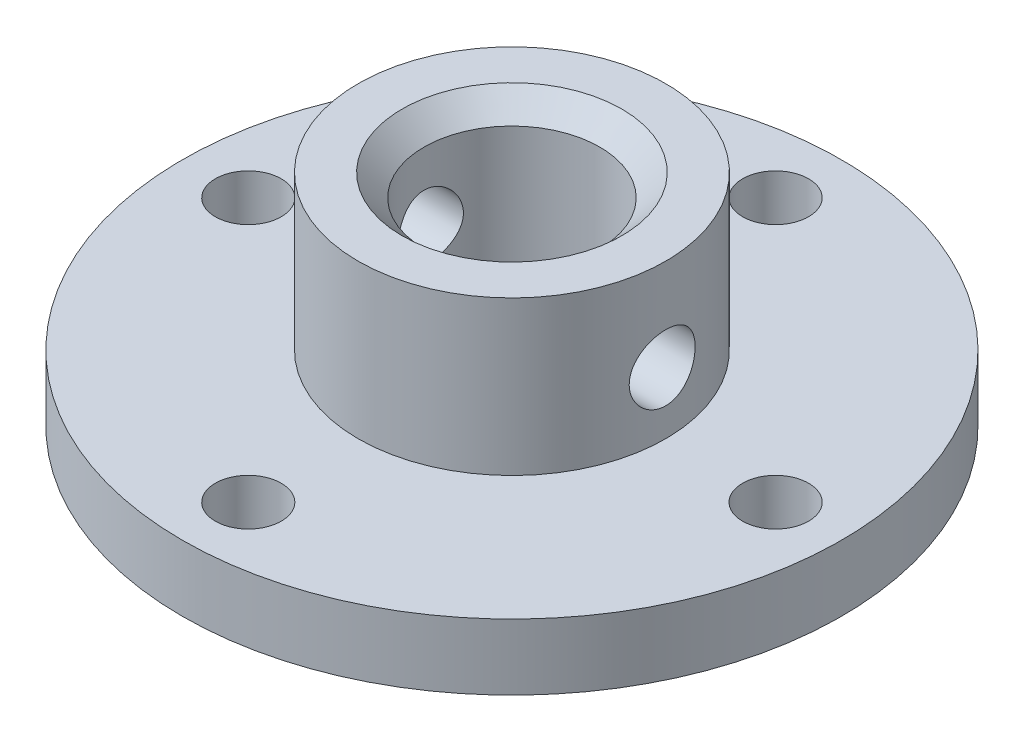
ISO-10303-21;
HEADER;
FILE_DESCRIPTION(('STEP AP214'),'2;1');
FILE_NAME('part.step','',(''),(''),'','','');
FILE_SCHEMA(('AUTOMOTIVE_DESIGN { 1 0 10303 214 1 1 1 1 }'));
ENDSEC;
DATA;
#1=APPLICATION_CONTEXT('core data for automotive mechanical design processes');
#2=APPLICATION_PROTOCOL_DEFINITION('international standard','automotive_design',2000,#1);
#3=PRODUCT_CONTEXT('',#1,'mechanical');
#4=PRODUCT('Part','Part','',(#3));
#5=PRODUCT_RELATED_PRODUCT_CATEGORY('part','',(#4));
#6=PRODUCT_DEFINITION_FORMATION('','',#4);
#7=PRODUCT_DEFINITION_CONTEXT('part definition',#1,'design');
#8=PRODUCT_DEFINITION('design','',#6,#7);
#9=PRODUCT_DEFINITION_SHAPE('','',#8);
#10=(LENGTH_UNIT() NAMED_UNIT(*) SI_UNIT(.MILLI.,.METRE.));
#11=(NAMED_UNIT(*) PLANE_ANGLE_UNIT() SI_UNIT($,.RADIAN.));
#12=(NAMED_UNIT(*) SI_UNIT($,.STERADIAN.) SOLID_ANGLE_UNIT());
#13=UNCERTAINTY_MEASURE_WITH_UNIT(LENGTH_MEASURE(1.E-05),#10,'distance_accuracy_value','');
#14=(GEOMETRIC_REPRESENTATION_CONTEXT(3) GLOBAL_UNCERTAINTY_ASSIGNED_CONTEXT((#13)) GLOBAL_UNIT_ASSIGNED_CONTEXT((#10,
#11,#12)) REPRESENTATION_CONTEXT('',''));
#15=CARTESIAN_POINT('',(0.,0.,0.));
#16=DIRECTION('',(0.,0.,1.));
#17=DIRECTION('',(1.,0.,0.));
#18=AXIS2_PLACEMENT_3D('',#15,#16,#17);
#19=CARTESIAN_POINT('',(0.,3.,0.));
#20=DIRECTION('',(0.,1.,0.));
#21=DIRECTION('',(0.,0.,1.));
#22=AXIS2_PLACEMENT_3D('',#19,#20,#21);
#23=PLANE('',#22);
#24=CARTESIAN_POINT('',(12.,3.,1.25693328198353E-13));
#25=DIRECTION('',(0.,1.,0.));
#26=DIRECTION('',(0.,0.,1.));
#27=AXIS2_PLACEMENT_3D('',#24,#25,#26);
#28=CIRCLE('',#27,1.5);
#29=CARTESIAN_POINT('',(12.,3.,1.50000000000013));
#30=VERTEX_POINT('',#29);
#31=EDGE_CURVE('E90',#30,#30,#28,.T.);
#32=ORIENTED_EDGE('',*,*,#31,.F.);
#33=EDGE_LOOP('',(#32));
#34=FACE_BOUND('',#33,.T.);
#35=CARTESIAN_POINT('',(0.,3.,12.));
#36=DIRECTION('',(0.,1.,0.));
#37=DIRECTION('',(0.,0.,1.));
#38=AXIS2_PLACEMENT_3D('',#35,#36,#37);
#39=CIRCLE('',#38,1.5);
#40=CARTESIAN_POINT('',(0.,3.,13.5));
#41=VERTEX_POINT('',#40);
#42=EDGE_CURVE('E301',#41,#41,#39,.T.);
#43=ORIENTED_EDGE('',*,*,#42,.F.);
#44=EDGE_LOOP('',(#43));
#45=FACE_BOUND('',#44,.T.);
#46=CARTESIAN_POINT('',(-12.,3.,0.));
#47=DIRECTION('',(0.,1.,0.));
#48=DIRECTION('',(0.,0.,1.));
#49=AXIS2_PLACEMENT_3D('',#46,#47,#48);
#50=CIRCLE('',#49,1.5);
#51=CARTESIAN_POINT('',(-12.,3.,1.49999999999996));
#52=VERTEX_POINT('',#51);
#53=EDGE_CURVE('E299',#52,#52,#50,.T.);
#54=ORIENTED_EDGE('',*,*,#53,.F.);
#55=EDGE_LOOP('',(#54));
#56=FACE_BOUND('',#55,.T.);
#57=CARTESIAN_POINT('',(0.,3.,-12.));
#58=DIRECTION('',(0.,1.,0.));
#59=DIRECTION('',(0.,0.,1.));
#60=AXIS2_PLACEMENT_3D('',#57,#58,#59);
#61=CIRCLE('',#60,1.5);
#62=CARTESIAN_POINT('',(0.,3.,-10.5));
#63=VERTEX_POINT('',#62);
#64=EDGE_CURVE('E129',#63,#63,#61,.T.);
#65=ORIENTED_EDGE('',*,*,#64,.F.);
#66=EDGE_LOOP('',(#65));
#67=FACE_BOUND('',#66,.T.);
#68=CARTESIAN_POINT('',(0.,3.,0.));
#69=DIRECTION('',(0.,1.,0.));
#70=DIRECTION('',(0.,0.,1.));
#71=AXIS2_PLACEMENT_3D('',#68,#69,#70);
#72=CIRCLE('',#71,15.);
#73=CARTESIAN_POINT('',(0.,3.,15.));
#74=VERTEX_POINT('',#73);
#75=EDGE_CURVE('E64',#74,#74,#72,.T.);
#76=ORIENTED_EDGE('',*,*,#75,.T.);
#77=EDGE_LOOP('',(#76));
#78=FACE_BOUND('',#77,.T.);
#79=CARTESIAN_POINT('',(0.,3.,0.));
#80=DIRECTION('',(0.,1.,0.));
#81=DIRECTION('',(0.,0.,1.));
#82=AXIS2_PLACEMENT_3D('',#79,#80,#81);
#83=CIRCLE('',#82,7.);
#84=CARTESIAN_POINT('',(0.,3.,7.));
#85=VERTEX_POINT('',#84);
#86=EDGE_CURVE('E163',#85,#85,#83,.T.);
#87=ORIENTED_EDGE('',*,*,#86,.F.);
#88=EDGE_LOOP('',(#87));
#89=FACE_BOUND('',#88,.T.);
#90=ADVANCED_FACE('F49',(#34,#45,#56,#67,#78,#89),#23,.T.);
#91=CARTESIAN_POINT('',(0.,0.,0.));
#92=DIRECTION('',(0.,1.,0.));
#93=DIRECTION('',(0.,0.,1.));
#94=AXIS2_PLACEMENT_3D('',#91,#92,#93);
#95=PLANE('',#94);
#96=CARTESIAN_POINT('',(12.,0.,1.25693328198353E-13));
#97=DIRECTION('',(0.,1.,0.));
#98=DIRECTION('',(0.,0.,1.));
#99=AXIS2_PLACEMENT_3D('',#96,#97,#98);
#100=CIRCLE('',#99,1.5);
#101=CARTESIAN_POINT('',(12.,0.,1.50000000000013));
#102=VERTEX_POINT('',#101);
#103=EDGE_CURVE('E73',#102,#102,#100,.T.);
#104=ORIENTED_EDGE('',*,*,#103,.T.);
#105=EDGE_LOOP('',(#104));
#106=FACE_BOUND('',#105,.T.);
#107=CARTESIAN_POINT('',(0.,0.,12.));
#108=DIRECTION('',(0.,1.,0.));
#109=DIRECTION('',(0.,0.,1.));
#110=AXIS2_PLACEMENT_3D('',#107,#108,#109);
#111=CIRCLE('',#110,1.5);
#112=CARTESIAN_POINT('',(0.,0.,13.5));
#113=VERTEX_POINT('',#112);
#114=EDGE_CURVE('E78',#113,#113,#111,.T.);
#115=ORIENTED_EDGE('',*,*,#114,.T.);
#116=EDGE_LOOP('',(#115));
#117=FACE_BOUND('',#116,.T.);
#118=CARTESIAN_POINT('',(-12.,0.,0.));
#119=DIRECTION('',(0.,1.,0.));
#120=DIRECTION('',(0.,0.,1.));
#121=AXIS2_PLACEMENT_3D('',#118,#119,#120);
#122=CIRCLE('',#121,1.5);
#123=CARTESIAN_POINT('',(-12.,0.,1.49999999999996));
#124=VERTEX_POINT('',#123);
#125=EDGE_CURVE('E82',#124,#124,#122,.T.);
#126=ORIENTED_EDGE('',*,*,#125,.T.);
#127=EDGE_LOOP('',(#126));
#128=FACE_BOUND('',#127,.T.);
#129=CARTESIAN_POINT('',(0.,0.,-12.));
#130=DIRECTION('',(0.,1.,0.));
#131=DIRECTION('',(0.,0.,1.));
#132=AXIS2_PLACEMENT_3D('',#129,#130,#131);
#133=CIRCLE('',#132,1.5);
#134=CARTESIAN_POINT('',(0.,0.,-10.5));
#135=VERTEX_POINT('',#134);
#136=EDGE_CURVE('E86',#135,#135,#133,.T.);
#137=ORIENTED_EDGE('',*,*,#136,.T.);
#138=EDGE_LOOP('',(#137));
#139=FACE_BOUND('',#138,.T.);
#140=CARTESIAN_POINT('',(0.,0.,0.));
#141=DIRECTION('',(0.,1.,0.));
#142=DIRECTION('',(0.,0.,1.));
#143=AXIS2_PLACEMENT_3D('',#140,#141,#142);
#144=CIRCLE('',#143,15.);
#145=CARTESIAN_POINT('',(0.,0.,15.));
#146=VERTEX_POINT('',#145);
#147=EDGE_CURVE('E70',#146,#146,#144,.T.);
#148=ORIENTED_EDGE('',*,*,#147,.F.);
#149=EDGE_LOOP('',(#148));
#150=FACE_BOUND('',#149,.T.);
#151=CARTESIAN_POINT('',(0.,0.,0.));
#152=DIRECTION('',(0.,1.,0.));
#153=DIRECTION('',(0.,0.,1.));
#154=AXIS2_PLACEMENT_3D('',#151,#152,#153);
#155=CIRCLE('',#154,4.);
#156=CARTESIAN_POINT('',(0.,0.,4.));
#157=VERTEX_POINT('',#156);
#158=EDGE_CURVE('E156',#157,#157,#155,.T.);
#159=ORIENTED_EDGE('',*,*,#158,.T.);
#160=EDGE_LOOP('',(#159));
#161=FACE_BOUND('',#160,.T.);
#162=ADVANCED_FACE('F143',(#106,#117,#128,#139,#150,#161),#95,.F.);
#163=CARTESIAN_POINT('',(0.,3.,0.));
#164=DIRECTION('',(0.,-1.,0.));
#165=DIRECTION('',(0.,0.,-1.));
#166=AXIS2_PLACEMENT_3D('',#163,#164,#165);
#167=CYLINDRICAL_SURFACE('',#166,15.);
#168=ORIENTED_EDGE('',*,*,#75,.F.);
#169=EDGE_LOOP('',(#168));
#170=FACE_BOUND('',#169,.T.);
#171=ORIENTED_EDGE('',*,*,#147,.T.);
#172=EDGE_LOOP('',(#171));
#173=FACE_BOUND('',#172,.T.);
#174=ADVANCED_FACE('F139',(#170,#173),#167,.T.);
#175=CARTESIAN_POINT('',(0.,3.,0.));
#176=DIRECTION('',(0.,-1.,0.));
#177=DIRECTION('',(0.,0.,-1.));
#178=AXIS2_PLACEMENT_3D('',#175,#176,#177);
#179=CYLINDRICAL_SURFACE('',#178,4.);
#180=CARTESIAN_POINT('',(0.,9.,0.));
#181=DIRECTION('',(0.,1.,0.));
#182=DIRECTION('',(0.,0.,1.));
#183=AXIS2_PLACEMENT_3D('',#180,#181,#182);
#184=CIRCLE('',#183,4.);
#185=CARTESIAN_POINT('',(0.,9.,4.));
#186=VERTEX_POINT('',#185);
#187=EDGE_CURVE('E57',#186,#186,#184,.T.);
#188=ORIENTED_EDGE('',*,*,#187,.T.);
#189=EDGE_LOOP('',(#188));
#190=FACE_BOUND('',#189,.T.);
#191=CARTESIAN_POINT('',(3.70809924354783,5.8,1.5));
#192=CARTESIAN_POINT('',(3.70809640633806,5.88100748372079,1.50000304106109));
#193=CARTESIAN_POINT('',(3.71078260240986,5.96199492250364,1.49341597549487));
#194=CARTESIAN_POINT('',(3.72116159304967,6.1215280829132,1.46736187895468));
#195=CARTESIAN_POINT('',(3.72885423767112,6.20007387759501,1.44789523373263));
#196=CARTESIAN_POINT('',(3.748254802809,6.35237537161353,1.39689657610574));
#197=CARTESIAN_POINT('',(3.7599530956926,6.42614205665108,1.36539347266348));
#198=CARTESIAN_POINT('',(3.78603134206598,6.56737189681884,1.29131856742698));
#199=CARTESIAN_POINT('',(3.80041210067323,6.63483315028252,1.24874344095039));
#200=CARTESIAN_POINT('',(3.83103574665713,6.76489031162282,1.15146661374162));
#201=CARTESIAN_POINT('',(3.84733341923603,6.82712852962939,1.09630381213306));
#202=CARTESIAN_POINT('',(3.87949750628547,6.94172281467149,0.976395839778926));
#203=CARTESIAN_POINT('',(3.89536382814785,6.99407677374185,0.911648630256679));
#204=CARTESIAN_POINT('',(3.92552873936553,7.08913951229561,0.7716946551776));
#205=CARTESIAN_POINT('',(3.93975561223505,7.13145947471586,0.696206947538027));
#206=CARTESIAN_POINT('',(3.96438007973847,7.20265117252491,0.538555771965246));
#207=CARTESIAN_POINT('',(3.97477900217006,7.23152757199197,0.456394630933535));
#208=CARTESIAN_POINT('',(3.99018697103439,7.27375789577462,0.291489341676831));
#209=CARTESIAN_POINT('',(3.99540915214774,7.28772762744046,0.208923197281595));
#210=CARTESIAN_POINT('',(4.0006401410794,7.30172120094499,0.0424643637947847));
#211=CARTESIAN_POINT('',(4.00065064414902,7.30174957761871,-0.0414278850628343));
#212=CARTESIAN_POINT('',(3.99559265903894,7.28821823853483,-0.203743543064477));
#213=CARTESIAN_POINT('',(3.99077541996683,7.27533070205118,-0.282232178266901));
#214=CARTESIAN_POINT('',(3.97693274932263,7.23746408477445,-0.435839217984393));
#215=CARTESIAN_POINT('',(3.96790701975577,7.21248414773796,-0.510957383430299));
#216=CARTESIAN_POINT('',(3.9463776916753,7.15082954832415,-0.656989017303105));
#217=CARTESIAN_POINT('',(3.93382539470077,7.11398999473159,-0.72782539228731));
#218=CARTESIAN_POINT('',(3.90651310225279,7.02980790307061,-0.86248660795756));
#219=CARTESIAN_POINT('',(3.8917523951284,6.9824619769824,-0.926309176932324));
#220=CARTESIAN_POINT('',(3.86052529655816,6.87537271371681,-1.04909048680094));
#221=CARTESIAN_POINT('',(3.84400963763882,6.81506608434957,-1.10754614526348));
#222=CARTESIAN_POINT('',(3.81182460645722,6.68540700667844,-1.21370395569342));
#223=CARTESIAN_POINT('',(3.79615544748847,6.61605229341336,-1.261403406929));
#224=CARTESIAN_POINT('',(3.76712703500335,6.46828053253717,-1.34565611808152));
#225=CARTESIAN_POINT('',(3.75382677150277,6.38969650631393,-1.38193847851831));
#226=CARTESIAN_POINT('',(3.73172438629002,6.22690377483242,-1.44056464441501));
#227=CARTESIAN_POINT('',(3.72291976205783,6.14269822840631,-1.46291620605595));
#228=CARTESIAN_POINT('',(3.71139597222848,5.97602403768404,-1.49190191709668));
#229=CARTESIAN_POINT('',(3.70836785241537,5.89371589446386,-1.49933521158966));
#230=CARTESIAN_POINT('',(3.70786539525016,5.72899064325826,-1.50057885636272));
#231=CARTESIAN_POINT('',(3.71038967003987,5.64657356764753,-1.49439261093762));
#232=CARTESIAN_POINT('',(3.72039381629735,5.48807007771232,-1.46929733520157));
#233=CARTESIAN_POINT('',(3.72763276216449,5.41186886423534,-1.45100618334224));
#234=CARTESIAN_POINT('',(3.74596487046362,5.2636520552798,-1.40299774640637));
#235=CARTESIAN_POINT('',(3.75705882250173,5.19163732083186,-1.37327812034623));
#236=CARTESIAN_POINT('',(3.7823624311608,5.05083556192379,-1.30200292275278));
#237=CARTESIAN_POINT('',(3.79667328892065,4.98227070786266,-1.26004545177047));
#238=CARTESIAN_POINT('',(3.82662814294291,4.85287101827396,-1.16591317862479));
#239=CARTESIAN_POINT('',(3.84227262594077,4.79203902537536,-1.11373463696435));
#240=CARTESIAN_POINT('',(3.87433046553184,4.6758316268049,-0.996727340900937));
#241=CARTESIAN_POINT('',(3.89072969357027,4.62104659123125,-0.93130634149106));
#242=CARTESIAN_POINT('',(3.92149874963302,4.52316163241056,-0.791797471753149));
#243=CARTESIAN_POINT('',(3.93586857107664,4.48006174705416,-0.717709573322672));
#244=CARTESIAN_POINT('',(3.96094985704552,4.40705394380039,-0.563016329468475));
#245=CARTESIAN_POINT('',(3.9716738133801,4.3771008762074,-0.482434433064625));
#246=CARTESIAN_POINT('',(3.98829436712571,4.33134358615008,-0.316881887523253));
#247=CARTESIAN_POINT('',(3.99419323299412,4.3155327145776,-0.231913320723592));
#248=CARTESIAN_POINT('',(4.00028407317073,4.29922559724517,-0.0653355852738146));
#249=CARTESIAN_POINT('',(4.00078860953764,4.29789051694101,0.0161807680608462));
#250=CARTESIAN_POINT('',(3.99684889809223,4.30841515944539,0.178226786412425));
#251=CARTESIAN_POINT('',(3.9924052471313,4.32027329088586,0.258756569245258));
#252=CARTESIAN_POINT('',(3.97921089603771,4.35625885149362,0.414548248377127));
#253=CARTESIAN_POINT('',(3.97056791378017,4.38007990587836,0.489890731068835));
#254=CARTESIAN_POINT('',(3.9498778362099,4.43901001338436,0.63551547300639));
#255=CARTESIAN_POINT('',(3.93783009655664,4.47412120330475,0.705796771275543));
#256=CARTESIAN_POINT('',(3.91090618300074,4.55631394350481,0.842540176994413));
#257=CARTESIAN_POINT('',(3.89593240108828,4.60383664051415,0.90871754884685));
#258=CARTESIAN_POINT('',(3.86499507694844,4.70880783018761,1.03241734752336));
#259=CARTESIAN_POINT('',(3.84903118274027,4.76625986580787,1.0899366712559));
#260=CARTESIAN_POINT('',(3.81688129739175,4.89306413164506,1.19781214236196));
#261=CARTESIAN_POINT('',(3.8007280534916,4.96288440215431,1.24762999816025));
#262=CARTESIAN_POINT('',(3.77098325003638,5.11041586957333,1.33484709556843));
#263=CARTESIAN_POINT('',(3.75739195631216,5.18812788405348,1.37224504878157));
#264=CARTESIAN_POINT('',(3.73402269853266,5.3529556809754,1.4346588697426));
#265=CARTESIAN_POINT('',(3.7244380329086,5.44033436651178,1.45906002899523));
#266=CARTESIAN_POINT('',(3.71147994336315,5.61848527195579,1.49172356722079));
#267=CARTESIAN_POINT('',(3.70810242179736,5.70925521270999,1.49999659339571));
#268=CARTESIAN_POINT('',(3.70809924354783,5.8,1.5));
#269=B_SPLINE_CURVE_WITH_KNOTS('',3,(#191,#192,#193,#194,#195,#196,#197,#198,#199,#200,#201,
#202,#203,#204,#205,#206,#207,#208,#209,#210,#211,#212,#213,#214,#215,#216,#217,#218,#219,#220,
#221,#222,#223,#224,#225,#226,#227,#228,#229,#230,#231,#232,#233,#234,#235,#236,#237,#238,#239,
#240,#241,#242,#243,#244,#245,#246,#247,#248,#249,#250,#251,#252,#253,#254,#255,#256,#257,#258,
#259,#260,#261,#262,#263,#264,#265,#266,#267,#268),.UNSPECIFIED.,.T.,.F.,(4,2,2,2,2,2,2,2,2,2,2,
2,2,2,2,2,2,2,2,2,2,2,2,2,2,2,2,2,2,2,2,2,2,2,2,2,2,2,4),(0.,0.24268454141617,0.485361814598855,
0.727459856757031,0.969630679682934,1.22274652401128,1.47591628822983,1.73770072136421,
1.9993942638133,2.24980018489679,2.50012465404857,2.73806472803194,2.97602165263335,
3.21744131210668,3.45893893628976,3.71456675065875,3.97025867827335,4.23162592252967,
4.49284751635474,4.73965657740485,4.98640395388885,5.22143845928199,5.45652113429526,
5.70041561005822,5.94439948466355,6.20385016993624,6.46330169650178,6.72185508890169,
6.98028685560127,7.22365720549936,7.4669982031948,7.70440274003891,7.94185223512831,
8.18928323676987,8.43680270894965,8.69738599542079,8.95799630544242,9.23003178870926,
9.50188762323053),.UNSPECIFIED.);
#270=CARTESIAN_POINT('',(3.70809924354783,5.8,1.5));
#271=VERTEX_POINT('',#270);
#272=EDGE_CURVE('E128',#271,#271,#269,.T.);
#273=ORIENTED_EDGE('',*,*,#272,.F.);
#274=EDGE_LOOP('',(#273));
#275=FACE_BOUND('',#274,.T.);
#276=CARTESIAN_POINT('',(-3.70809924354783,5.8,1.5));
#277=CARTESIAN_POINT('',(-3.70809640633806,5.71899251627921,1.50000304106109));
#278=CARTESIAN_POINT('',(-3.71078260240986,5.63800507749636,1.49341597549487));
#279=CARTESIAN_POINT('',(-3.72116159304967,5.4784719170868,1.46736187895468));
#280=CARTESIAN_POINT('',(-3.72885423767112,5.39992612240499,1.44789523373263));
#281=CARTESIAN_POINT('',(-3.748254802809,5.24762462838647,1.39689657610574));
#282=CARTESIAN_POINT('',(-3.7599530956926,5.17385794334892,1.36539347266348));
#283=CARTESIAN_POINT('',(-3.78603134206598,5.03262810318116,1.29131856742698));
#284=CARTESIAN_POINT('',(-3.80041210067323,4.96516684971748,1.24874344095039));
#285=CARTESIAN_POINT('',(-3.83103574665713,4.83510968837718,1.15146661374162));
#286=CARTESIAN_POINT('',(-3.84733341923603,4.77287147037061,1.09630381213306));
#287=CARTESIAN_POINT('',(-3.87949750628547,4.65827718532851,0.976395839778926));
#288=CARTESIAN_POINT('',(-3.89536382814785,4.60592322625814,0.911648630256679));
#289=CARTESIAN_POINT('',(-3.92552873936553,4.51086048770439,0.7716946551776));
#290=CARTESIAN_POINT('',(-3.93975561223505,4.46854052528414,0.696206947538027));
#291=CARTESIAN_POINT('',(-3.96438007973847,4.39734882747509,0.538555771965246));
#292=CARTESIAN_POINT('',(-3.97477900217006,4.36847242800803,0.456394630933535));
#293=CARTESIAN_POINT('',(-3.99018697103439,4.32624210422538,0.291489341676831));
#294=CARTESIAN_POINT('',(-3.99540915214774,4.31227237255954,0.208923197281595));
#295=CARTESIAN_POINT('',(-4.0006401410794,4.29827879905501,0.0424643637947847));
#296=CARTESIAN_POINT('',(-4.00065064414902,4.29825042238129,-0.0414278850628343));
#297=CARTESIAN_POINT('',(-3.99559265903894,4.31178176146517,-0.203743543064477));
#298=CARTESIAN_POINT('',(-3.99077541996683,4.32466929794882,-0.282232178266901));
#299=CARTESIAN_POINT('',(-3.97693274932263,4.36253591522555,-0.435839217984393));
#300=CARTESIAN_POINT('',(-3.96790701975577,4.38751585226204,-0.510957383430299));
#301=CARTESIAN_POINT('',(-3.9463776916753,4.44917045167585,-0.656989017303105));
#302=CARTESIAN_POINT('',(-3.93382539470077,4.48601000526841,-0.72782539228731));
#303=CARTESIAN_POINT('',(-3.90651310225279,4.57019209692939,-0.86248660795756));
#304=CARTESIAN_POINT('',(-3.8917523951284,4.6175380230176,-0.926309176932324));
#305=CARTESIAN_POINT('',(-3.86052529655816,4.72462728628319,-1.04909048680094));
#306=CARTESIAN_POINT('',(-3.84400963763882,4.78493391565043,-1.10754614526348));
#307=CARTESIAN_POINT('',(-3.81182460645722,4.91459299332156,-1.21370395569342));
#308=CARTESIAN_POINT('',(-3.79615544748847,4.98394770658664,-1.261403406929));
#309=CARTESIAN_POINT('',(-3.76712703500335,5.13171946746282,-1.34565611808152));
#310=CARTESIAN_POINT('',(-3.75382677150277,5.21030349368607,-1.38193847851831));
#311=CARTESIAN_POINT('',(-3.73172438629002,5.37309622516757,-1.44056464441501));
#312=CARTESIAN_POINT('',(-3.72291976205783,5.45730177159369,-1.46291620605595));
#313=CARTESIAN_POINT('',(-3.71139597222848,5.62397596231595,-1.49190191709668));
#314=CARTESIAN_POINT('',(-3.70836785241537,5.70628410553614,-1.49933521158966));
#315=CARTESIAN_POINT('',(-3.70786539525016,5.87100935674174,-1.50057885636272));
#316=CARTESIAN_POINT('',(-3.71038967003987,5.95342643235247,-1.49439261093762));
#317=CARTESIAN_POINT('',(-3.72039381629735,6.11192992228768,-1.46929733520157));
#318=CARTESIAN_POINT('',(-3.72763276216449,6.18813113576466,-1.45100618334224));
#319=CARTESIAN_POINT('',(-3.74596487046362,6.3363479447202,-1.40299774640637));
#320=CARTESIAN_POINT('',(-3.75705882250173,6.40836267916814,-1.37327812034623));
#321=CARTESIAN_POINT('',(-3.7823624311608,6.54916443807621,-1.30200292275278));
#322=CARTESIAN_POINT('',(-3.79667328892065,6.61772929213734,-1.26004545177047));
#323=CARTESIAN_POINT('',(-3.82662814294291,6.74712898172604,-1.16591317862479));
#324=CARTESIAN_POINT('',(-3.84227262594077,6.80796097462463,-1.11373463696435));
#325=CARTESIAN_POINT('',(-3.87433046553184,6.9241683731951,-0.996727340900937));
#326=CARTESIAN_POINT('',(-3.89072969357027,6.97895340876875,-0.93130634149106));
#327=CARTESIAN_POINT('',(-3.92149874963302,7.07683836758944,-0.791797471753149));
#328=CARTESIAN_POINT('',(-3.93586857107664,7.11993825294584,-0.717709573322672));
#329=CARTESIAN_POINT('',(-3.96094985704552,7.19294605619961,-0.563016329468475));
#330=CARTESIAN_POINT('',(-3.9716738133801,7.2228991237926,-0.482434433064625));
#331=CARTESIAN_POINT('',(-3.98829436712571,7.26865641384992,-0.316881887523253));
#332=CARTESIAN_POINT('',(-3.99419323299412,7.2844672854224,-0.231913320723592));
#333=CARTESIAN_POINT('',(-4.00028407317073,7.30077440275483,-0.0653355852738146));
#334=CARTESIAN_POINT('',(-4.00078860953764,7.30210948305899,0.0161807680608462));
#335=CARTESIAN_POINT('',(-3.99684889809223,7.29158484055461,0.178226786412425));
#336=CARTESIAN_POINT('',(-3.9924052471313,7.27972670911414,0.258756569245258));
#337=CARTESIAN_POINT('',(-3.97921089603771,7.24374114850638,0.414548248377127));
#338=CARTESIAN_POINT('',(-3.97056791378017,7.21992009412164,0.489890731068835));
#339=CARTESIAN_POINT('',(-3.9498778362099,7.16098998661564,0.635515473006391));
#340=CARTESIAN_POINT('',(-3.93783009655664,7.12587879669525,0.705796771275543));
#341=CARTESIAN_POINT('',(-3.91090618300074,7.04368605649519,0.842540176994413));
#342=CARTESIAN_POINT('',(-3.89593240108828,6.99616335948585,0.90871754884685));
#343=CARTESIAN_POINT('',(-3.86499507694844,6.89119216981239,1.03241734752336));
#344=CARTESIAN_POINT('',(-3.84903118274027,6.83374013419212,1.0899366712559));
#345=CARTESIAN_POINT('',(-3.81688129739175,6.70693586835494,1.19781214236196));
#346=CARTESIAN_POINT('',(-3.8007280534916,6.63711559784569,1.24762999816025));
#347=CARTESIAN_POINT('',(-3.77098325003638,6.48958413042667,1.33484709556843));
#348=CARTESIAN_POINT('',(-3.75739195631216,6.41187211594652,1.37224504878157));
#349=CARTESIAN_POINT('',(-3.73402269853266,6.24704431902459,1.4346588697426));
#350=CARTESIAN_POINT('',(-3.7244380329086,6.15966563348822,1.45906002899523));
#351=CARTESIAN_POINT('',(-3.71147994336315,5.98151472804421,1.49172356722079));
#352=CARTESIAN_POINT('',(-3.70810242179736,5.89074478729001,1.49999659339571));
#353=CARTESIAN_POINT('',(-3.70809924354783,5.8,1.5));
#354=B_SPLINE_CURVE_WITH_KNOTS('',3,(#276,#277,#278,#279,#280,#281,#282,#283,#284,#285,#286,
#287,#288,#289,#290,#291,#292,#293,#294,#295,#296,#297,#298,#299,#300,#301,#302,#303,#304,#305,
#306,#307,#308,#309,#310,#311,#312,#313,#314,#315,#316,#317,#318,#319,#320,#321,#322,#323,#324,
#325,#326,#327,#328,#329,#330,#331,#332,#333,#334,#335,#336,#337,#338,#339,#340,#341,#342,#343,
#344,#345,#346,#347,#348,#349,#350,#351,#352,#353),.UNSPECIFIED.,.T.,.F.,(4,2,2,2,2,2,2,2,2,2,2,
2,2,2,2,2,2,2,2,2,2,2,2,2,2,2,2,2,2,2,2,2,2,2,2,2,2,2,4),(0.,0.24268454141617,0.485361814598855,
0.727459856757031,0.969630679682934,1.22274652401128,1.47591628822983,1.73770072136421,
1.9993942638133,2.24980018489679,2.50012465404857,2.73806472803194,2.97602165263335,
3.21744131210668,3.45893893628976,3.71456675065875,3.97025867827335,4.23162592252967,
4.49284751635474,4.73965657740485,4.98640395388885,5.22143845928199,5.45652113429526,
5.70041561005822,5.94439948466355,6.20385016993624,6.46330169650178,6.72185508890169,
6.98028685560127,7.22365720549936,7.4669982031948,7.70440274003891,7.94185223512831,
8.18928323676987,8.43680270894965,8.69738599542079,8.95799630544242,9.23003178870926,
9.50188762323053),.UNSPECIFIED.);
#355=CARTESIAN_POINT('',(-3.70809924354783,5.8,1.5));
#356=VERTEX_POINT('',#355);
#357=EDGE_CURVE('E99',#356,#356,#354,.T.);
#358=ORIENTED_EDGE('',*,*,#357,.F.);
#359=EDGE_LOOP('',(#358));
#360=FACE_BOUND('',#359,.T.);
#361=ORIENTED_EDGE('',*,*,#158,.F.);
#362=EDGE_LOOP('',(#361));
#363=FACE_BOUND('',#362,.T.);
#364=ADVANCED_FACE('F135',(#190,#275,#360,#363),#179,.F.);
#365=CARTESIAN_POINT('',(0.,10.,0.));
#366=DIRECTION('',(0.,1.,0.));
#367=DIRECTION('',(0.,0.,1.));
#368=AXIS2_PLACEMENT_3D('',#365,#366,#367);
#369=PLANE('',#368);
#370=CARTESIAN_POINT('',(0.,10.,0.));
#371=DIRECTION('',(0.,1.,0.));
#372=DIRECTION('',(0.,0.,1.));
#373=AXIS2_PLACEMENT_3D('',#370,#371,#372);
#374=CIRCLE('',#373,5.);
#375=CARTESIAN_POINT('',(0.,10.,5.));
#376=VERTEX_POINT('',#375);
#377=EDGE_CURVE('E11',#376,#376,#374,.F.);
#378=ORIENTED_EDGE('',*,*,#377,.T.);
#379=EDGE_LOOP('',(#378));
#380=FACE_BOUND('',#379,.T.);
#381=CARTESIAN_POINT('',(0.,10.,0.));
#382=DIRECTION('',(0.,1.,0.));
#383=DIRECTION('',(0.,0.,1.));
#384=AXIS2_PLACEMENT_3D('',#381,#382,#383);
#385=CIRCLE('',#384,7.);
#386=CARTESIAN_POINT('',(0.,10.,7.));
#387=VERTEX_POINT('',#386);
#388=EDGE_CURVE('E160',#387,#387,#385,.T.);
#389=ORIENTED_EDGE('',*,*,#388,.T.);
#390=EDGE_LOOP('',(#389));
#391=FACE_BOUND('',#390,.T.);
#392=ADVANCED_FACE('F116',(#380,#391),#369,.T.);
#393=CARTESIAN_POINT('',(0.,10.,0.));
#394=DIRECTION('',(0.,-1.,0.));
#395=DIRECTION('',(0.,0.,-1.));
#396=AXIS2_PLACEMENT_3D('',#393,#394,#395);
#397=CYLINDRICAL_SURFACE('',#396,7.);
#398=CARTESIAN_POINT('',(6.83739716558867,5.8,1.5));
#399=CARTESIAN_POINT('',(6.83739884558951,5.88321115248195,1.49999708238613));
#400=CARTESIAN_POINT('',(6.83893272341929,5.96645777394212,1.49305236244768));
#401=CARTESIAN_POINT('',(6.84489178429867,6.13058667224201,1.46548559252999));
#402=CARTESIAN_POINT('',(6.84931911211841,6.21146714867621,1.44485339653622));
#403=CARTESIAN_POINT('',(6.86054115293409,6.3684657495742,1.39058863684599));
#404=CARTESIAN_POINT('',(6.86733332725825,6.44458887812147,1.35697000991314));
#405=CARTESIAN_POINT('',(6.88251670848644,6.59011527394461,1.27772617673341));
#406=CARTESIAN_POINT('',(6.89090786877545,6.65951873702908,1.23210132048776));
#407=CARTESIAN_POINT('',(6.90849578796654,6.79076296148212,1.12935142570221));
#408=CARTESIAN_POINT('',(6.91770249871754,6.85247887623996,1.07206859483983));
#409=CARTESIAN_POINT('',(6.93579691710397,6.96550355440578,0.947969508129577));
#410=CARTESIAN_POINT('',(6.94468460051416,7.01681152886007,0.881152530217676));
#411=CARTESIAN_POINT('',(6.96124769109432,7.10805544449143,0.739047288464582));
#412=CARTESIAN_POINT('',(6.96890998819429,7.14787165577062,0.663680488229954));
#413=CARTESIAN_POINT('',(6.98204671042934,7.21422769144629,0.507134269342595));
#414=CARTESIAN_POINT('',(6.98752137103329,7.24076894478628,0.425955477380312));
#415=CARTESIAN_POINT('',(6.9955956528118,7.27942997093134,0.261387187671511));
#416=CARTESIAN_POINT('',(6.99823733378385,7.29176092855243,0.178049400596923));
#417=CARTESIAN_POINT('',(7.00049362207002,7.30231127731326,0.0104489453066446));
#418=CARTESIAN_POINT('',(7.00010856232698,7.30053222056076,-0.0738136201647593));
#419=CARTESIAN_POINT('',(6.99638700862558,7.28307103533642,-0.239417029250512));
#420=CARTESIAN_POINT('',(6.99309883152432,7.26761649971008,-0.320783115362113));
#421=CARTESIAN_POINT('',(6.98399541589104,7.22360531814814,-0.479739463978389));
#422=CARTESIAN_POINT('',(6.97818006616518,7.19504809570026,-0.557329560175054));
#423=CARTESIAN_POINT('',(6.96459754646858,7.12543854111148,-0.707167497556553));
#424=CARTESIAN_POINT('',(6.95681685803946,7.08429923279565,-0.779373657015789));
#425=CARTESIAN_POINT('',(6.94015793743865,6.9907580318364,-0.915940926562846));
#426=CARTESIAN_POINT('',(6.93127956144693,6.9383546626997,-0.980301006451528));
#427=CARTESIAN_POINT('',(6.91319326460925,6.82253145547214,-1.10070208800198));
#428=CARTESIAN_POINT('',(6.90398230372853,6.75891242064296,-1.1565511732025));
#429=CARTESIAN_POINT('',(6.88643566831974,6.62311671493149,-1.25682243234728));
#430=CARTESIAN_POINT('',(6.87810001563386,6.55093983059475,-1.30124432118068));
#431=CARTESIAN_POINT('',(6.86324023586723,6.39977549893624,-1.37748077573296));
#432=CARTESIAN_POINT('',(6.85672115127775,6.32076987614756,-1.40926035088923));
#433=CARTESIAN_POINT('',(6.84630340806617,6.15836723405356,-1.45903495159115));
#434=CARTESIAN_POINT('',(6.84240435218483,6.07497088255681,-1.47703206694628));
#435=CARTESIAN_POINT('',(6.83774881255446,5.90790424735029,-1.49843586024652));
#436=CARTESIAN_POINT('',(6.83693227051701,5.8242713249227,-1.5021214192864));
#437=CARTESIAN_POINT('',(6.83837239573993,5.6575860068183,-1.49555139642373));
#438=CARTESIAN_POINT('',(6.84062886101063,5.57453357334645,-1.48529673081635));
#439=CARTESIAN_POINT('',(6.84790415484206,5.41232956501924,-1.45137894635584));
#440=CARTESIAN_POINT('',(6.85289155274364,5.33314456740304,-1.42786830251553));
#441=CARTESIAN_POINT('',(6.86503859869777,5.17983766246708,-1.3682705294675));
#442=CARTESIAN_POINT('',(6.87219844772849,5.10571622436581,-1.33218223662818));
#443=CARTESIAN_POINT('',(6.88801634080345,4.96343031524108,-1.24783504416705));
#444=CARTESIAN_POINT('',(6.89669501746317,4.89537041798781,-1.19940368590792));
#445=CARTESIAN_POINT('',(6.91451775360139,4.7682416541262,-1.09197183833601));
#446=CARTESIAN_POINT('',(6.92366186834461,4.70917385855153,-1.03297009182161));
#447=CARTESIAN_POINT('',(6.94158239990173,4.60062969705524,-0.904812764420814));
#448=CARTESIAN_POINT('',(6.95034935607746,4.55134308384299,-0.83549492582877));
#449=CARTESIAN_POINT('',(6.96635610714901,4.46511459064895,-0.689401481282276));
#450=CARTESIAN_POINT('',(6.97359597176692,4.42817214702717,-0.61262621604374));
#451=CARTESIAN_POINT('',(6.98569278381574,4.36794794536152,-0.45426541898204));
#452=CARTESIAN_POINT('',(6.99056443803698,4.34458169625372,-0.372713193075173));
#453=CARTESIAN_POINT('',(6.9974393930198,4.31190829426768,-0.20672517700329));
#454=CARTESIAN_POINT('',(6.99944309312296,4.30259918402609,-0.122289789973994));
#455=CARTESIAN_POINT('',(7.00034511009057,4.29838934758814,0.0452637170528284));
#456=CARTESIAN_POINT('',(6.99930459001667,4.30320484139538,0.128374505509229));
#457=CARTESIAN_POINT('',(6.99436552363383,4.32647476351903,0.29257293841596));
#458=CARTESIAN_POINT('',(6.99046702473686,4.34492896557832,0.373660616405284));
#459=CARTESIAN_POINT('',(6.98025388638537,4.39481880624949,0.531301948487269));
#460=CARTESIAN_POINT('',(6.97394646430493,4.42621568938556,0.607868365073177));
#461=CARTESIAN_POINT('',(6.95959036050661,4.50106127116912,0.75468495672322));
#462=CARTESIAN_POINT('',(6.9515415172034,4.54451108830603,0.824934544796141));
#463=CARTESIAN_POINT('',(6.93439809934493,4.64316231874267,0.958512306895243));
#464=CARTESIAN_POINT('',(6.92528708907874,4.69856415832131,1.02169036510577));
#465=CARTESIAN_POINT('',(6.90713690075836,4.81914061025035,1.13795001457643));
#466=CARTESIAN_POINT('',(6.89809774045682,4.88431756335561,1.19102918062422));
#467=CARTESIAN_POINT('',(6.88098693651916,5.02359049318567,1.28623261596675));
#468=CARTESIAN_POINT('',(6.87292905956533,5.09778935828702,1.32820897809616));
#469=CARTESIAN_POINT('',(6.85886497228049,5.25234372092325,1.39903004659825));
#470=CARTESIAN_POINT('',(6.85285699581573,5.33269384525307,1.42788606423931));
#471=CARTESIAN_POINT('',(6.84470560641996,5.47762613118586,1.46638607121557));
#472=CARTESIAN_POINT('',(6.84198283087953,5.54141167570782,1.47896752507743));
#473=CARTESIAN_POINT('',(6.83832799504406,5.67012431157732,1.49577544043437));
#474=CARTESIAN_POINT('',(6.83739585430069,5.73505135150832,1.50000227727981));
#475=CARTESIAN_POINT('',(6.83739716558867,5.8,1.5));
#476=B_SPLINE_CURVE_WITH_KNOTS('',3,(#398,#399,#400,#401,#402,#403,#404,#405,#406,#407,#408,
#409,#410,#411,#412,#413,#414,#415,#416,#417,#418,#419,#420,#421,#422,#423,#424,#425,#426,#427,
#428,#429,#430,#431,#432,#433,#434,#435,#436,#437,#438,#439,#440,#441,#442,#443,#444,#445,#446,
#447,#448,#449,#450,#451,#452,#453,#454,#455,#456,#457,#458,#459,#460,#461,#462,#463,#464,#465,
#466,#467,#468,#469,#470,#471,#472,#473,#474,#475),.UNSPECIFIED.,.T.,.F.,(4,2,2,2,2,2,2,2,2,2,2,
2,2,2,2,2,2,2,2,2,2,2,2,2,2,2,2,2,2,2,2,2,2,2,2,2,2,2,4),(0.,0.249395482027528,
0.498976038479964,0.74828949115276,0.997595676735284,1.25053229582692,1.50348808112879,
1.75899134820278,2.01446710646267,2.26609508151929,2.51769537777241,2.76518557667371,
3.01268666607584,3.26193888143437,3.51122378872315,3.76548960779295,4.01976177023092,
4.27473287411781,4.52966530953838,4.77960433192523,5.02952692653916,5.27663180749374,
5.5237595556315,5.77455010216318,6.02537049659078,6.2806621468321,6.53594213875541,
6.78961589824375,7.04325433208539,7.29183199644126,7.54040553715099,7.78824009619483,
8.03609766151365,8.28848914160965,8.54094115631232,8.79660380167248,9.05204561611687,
9.24671456122272,9.44137476018022),.UNSPECIFIED.);
#477=CARTESIAN_POINT('',(6.83739716558867,5.8,1.5));
#478=VERTEX_POINT('',#477);
#479=EDGE_CURVE('E91',#478,#478,#476,.T.);
#480=ORIENTED_EDGE('',*,*,#479,.T.);
#481=EDGE_LOOP('',(#480));
#482=FACE_BOUND('',#481,.T.);
#483=CARTESIAN_POINT('',(-6.83739716558867,5.8,1.5));
#484=CARTESIAN_POINT('',(-6.83739884558951,5.71678884751805,1.49999708238613));
#485=CARTESIAN_POINT('',(-6.83893272341929,5.63354222605788,1.49305236244768));
#486=CARTESIAN_POINT('',(-6.84489178429867,5.46941332775799,1.46548559252999));
#487=CARTESIAN_POINT('',(-6.84931911211841,5.38853285132379,1.44485339653622));
#488=CARTESIAN_POINT('',(-6.86054115293409,5.23153425042579,1.39058863684599));
#489=CARTESIAN_POINT('',(-6.86733332725825,5.15541112187853,1.35697000991314));
#490=CARTESIAN_POINT('',(-6.88251670848644,5.00988472605539,1.27772617673341));
#491=CARTESIAN_POINT('',(-6.89090786877545,4.94048126297092,1.23210132048776));
#492=CARTESIAN_POINT('',(-6.90849578796654,4.80923703851788,1.12935142570221));
#493=CARTESIAN_POINT('',(-6.91770249871754,4.74752112376004,1.07206859483983));
#494=CARTESIAN_POINT('',(-6.93579691710397,4.63449644559421,0.947969508129577));
#495=CARTESIAN_POINT('',(-6.94468460051416,4.58318847113993,0.881152530217676));
#496=CARTESIAN_POINT('',(-6.96124769109432,4.49194455550857,0.739047288464582));
#497=CARTESIAN_POINT('',(-6.96890998819429,4.45212834422938,0.663680488229953));
#498=CARTESIAN_POINT('',(-6.98204671042934,4.38577230855371,0.507134269342595));
#499=CARTESIAN_POINT('',(-6.98752137103329,4.35923105521372,0.425955477380312));
#500=CARTESIAN_POINT('',(-6.9955956528118,4.32057002906866,0.261387187671511));
#501=CARTESIAN_POINT('',(-6.99823733378385,4.30823907144757,0.178049400596923));
#502=CARTESIAN_POINT('',(-7.00049362207002,4.29768872268674,0.0104489453066446));
#503=CARTESIAN_POINT('',(-7.00010856232698,4.29946777943924,-0.0738136201647593));
#504=CARTESIAN_POINT('',(-6.99638700862558,4.31692896466358,-0.239417029250512));
#505=CARTESIAN_POINT('',(-6.99309883152432,4.33238350028992,-0.320783115362113));
#506=CARTESIAN_POINT('',(-6.98399541589104,4.37639468185186,-0.479739463978389));
#507=CARTESIAN_POINT('',(-6.97818006616518,4.40495190429974,-0.557329560175054));
#508=CARTESIAN_POINT('',(-6.96459754646858,4.47456145888852,-0.707167497556553));
#509=CARTESIAN_POINT('',(-6.95681685803946,4.51570076720435,-0.779373657015789));
#510=CARTESIAN_POINT('',(-6.94015793743865,4.6092419681636,-0.915940926562846));
#511=CARTESIAN_POINT('',(-6.93127956144693,4.6616453373003,-0.980301006451528));
#512=CARTESIAN_POINT('',(-6.91319326460925,4.77746854452786,-1.10070208800198));
#513=CARTESIAN_POINT('',(-6.90398230372853,4.84108757935703,-1.1565511732025));
#514=CARTESIAN_POINT('',(-6.88643566831974,4.97688328506851,-1.25682243234728));
#515=CARTESIAN_POINT('',(-6.87810001563386,5.04906016940525,-1.30124432118068));
#516=CARTESIAN_POINT('',(-6.86324023586723,5.20022450106376,-1.37748077573296));
#517=CARTESIAN_POINT('',(-6.85672115127775,5.27923012385244,-1.40926035088923));
#518=CARTESIAN_POINT('',(-6.84630340806617,5.44163276594644,-1.45903495159115));
#519=CARTESIAN_POINT('',(-6.84240435218483,5.52502911744319,-1.47703206694628));
#520=CARTESIAN_POINT('',(-6.83774881255446,5.69209575264971,-1.49843586024652));
#521=CARTESIAN_POINT('',(-6.83693227051701,5.7757286750773,-1.5021214192864));
#522=CARTESIAN_POINT('',(-6.83837239573993,5.94241399318169,-1.49555139642373));
#523=CARTESIAN_POINT('',(-6.84062886101063,6.02546642665355,-1.48529673081635));
#524=CARTESIAN_POINT('',(-6.84790415484206,6.18767043498076,-1.45137894635584));
#525=CARTESIAN_POINT('',(-6.85289155274364,6.26685543259696,-1.42786830251553));
#526=CARTESIAN_POINT('',(-6.86503859869777,6.42016233753292,-1.3682705294675));
#527=CARTESIAN_POINT('',(-6.87219844772849,6.49428377563419,-1.33218223662818));
#528=CARTESIAN_POINT('',(-6.88801634080345,6.63656968475892,-1.24783504416705));
#529=CARTESIAN_POINT('',(-6.89669501746317,6.70462958201218,-1.19940368590792));
#530=CARTESIAN_POINT('',(-6.91451775360139,6.83175834587379,-1.09197183833601));
#531=CARTESIAN_POINT('',(-6.92366186834461,6.89082614144847,-1.03297009182161));
#532=CARTESIAN_POINT('',(-6.94158239990173,6.99937030294476,-0.904812764420814));
#533=CARTESIAN_POINT('',(-6.95034935607746,7.04865691615701,-0.83549492582877));
#534=CARTESIAN_POINT('',(-6.96635610714901,7.13488540935105,-0.689401481282276));
#535=CARTESIAN_POINT('',(-6.97359597176692,7.17182785297283,-0.61262621604374));
#536=CARTESIAN_POINT('',(-6.98569278381574,7.23205205463848,-0.45426541898204));
#537=CARTESIAN_POINT('',(-6.99056443803698,7.25541830374628,-0.372713193075173));
#538=CARTESIAN_POINT('',(-6.9974393930198,7.28809170573232,-0.20672517700329));
#539=CARTESIAN_POINT('',(-6.99944309312296,7.29740081597391,-0.122289789973994));
#540=CARTESIAN_POINT('',(-7.00034511009057,7.30161065241186,0.0452637170528284));
#541=CARTESIAN_POINT('',(-6.99930459001667,7.29679515860462,0.128374505509229));
#542=CARTESIAN_POINT('',(-6.99436552363383,7.27352523648097,0.29257293841596));
#543=CARTESIAN_POINT('',(-6.99046702473686,7.25507103442168,0.373660616405284));
#544=CARTESIAN_POINT('',(-6.98025388638537,7.20518119375051,0.531301948487269));
#545=CARTESIAN_POINT('',(-6.97394646430493,7.17378431061444,0.607868365073177));
#546=CARTESIAN_POINT('',(-6.95959036050661,7.09893872883088,0.75468495672322));
#547=CARTESIAN_POINT('',(-6.9515415172034,7.05548891169397,0.824934544796141));
#548=CARTESIAN_POINT('',(-6.93439809934493,6.95683768125733,0.958512306895243));
#549=CARTESIAN_POINT('',(-6.92528708907874,6.90143584167869,1.02169036510577));
#550=CARTESIAN_POINT('',(-6.90713690075836,6.78085938974965,1.13795001457643));
#551=CARTESIAN_POINT('',(-6.89809774045682,6.71568243664439,1.19102918062422));
#552=CARTESIAN_POINT('',(-6.88098693651916,6.57640950681432,1.28623261596675));
#553=CARTESIAN_POINT('',(-6.87292905956533,6.50221064171298,1.32820897809616));
#554=CARTESIAN_POINT('',(-6.85886497228049,6.34765627907675,1.39903004659825));
#555=CARTESIAN_POINT('',(-6.85285699581573,6.26730615474693,1.42788606423931));
#556=CARTESIAN_POINT('',(-6.84470560641996,6.12237386881414,1.46638607121557));
#557=CARTESIAN_POINT('',(-6.84198283087953,6.05858832429217,1.47896752507743));
#558=CARTESIAN_POINT('',(-6.83832799504406,5.92987568842268,1.49577544043437));
#559=CARTESIAN_POINT('',(-6.83739585430069,5.86494864849168,1.50000227727981));
#560=CARTESIAN_POINT('',(-6.83739716558867,5.8,1.5));
#561=B_SPLINE_CURVE_WITH_KNOTS('',3,(#483,#484,#485,#486,#487,#488,#489,#490,#491,#492,#493,
#494,#495,#496,#497,#498,#499,#500,#501,#502,#503,#504,#505,#506,#507,#508,#509,#510,#511,#512,
#513,#514,#515,#516,#517,#518,#519,#520,#521,#522,#523,#524,#525,#526,#527,#528,#529,#530,#531,
#532,#533,#534,#535,#536,#537,#538,#539,#540,#541,#542,#543,#544,#545,#546,#547,#548,#549,#550,
#551,#552,#553,#554,#555,#556,#557,#558,#559,#560),.UNSPECIFIED.,.T.,.F.,(4,2,2,2,2,2,2,2,2,2,2,
2,2,2,2,2,2,2,2,2,2,2,2,2,2,2,2,2,2,2,2,2,2,2,2,2,2,2,4),(0.,0.249395482027528,
0.498976038479964,0.74828949115276,0.997595676735284,1.25053229582692,1.50348808112879,
1.75899134820278,2.01446710646267,2.26609508151929,2.51769537777241,2.76518557667371,
3.01268666607584,3.26193888143437,3.51122378872315,3.76548960779295,4.01976177023092,
4.27473287411781,4.52966530953838,4.77960433192523,5.02952692653916,5.27663180749375,
5.5237595556315,5.77455010216318,6.02537049659078,6.2806621468321,6.53594213875541,
6.78961589824375,7.04325433208539,7.29183199644126,7.54040553715099,7.78824009619483,
8.03609766151365,8.28848914160965,8.54094115631232,8.79660380167248,9.05204561611687,
9.24671456122272,9.44137476018022),.UNSPECIFIED.);
#562=CARTESIAN_POINT('',(-6.83739716558867,5.8,1.5));
#563=VERTEX_POINT('',#562);
#564=EDGE_CURVE('E77',#563,#563,#561,.T.);
#565=ORIENTED_EDGE('',*,*,#564,.T.);
#566=EDGE_LOOP('',(#565));
#567=FACE_BOUND('',#566,.T.);
#568=ORIENTED_EDGE('',*,*,#388,.F.);
#569=EDGE_LOOP('',(#568));
#570=FACE_BOUND('',#569,.T.);
#571=ORIENTED_EDGE('',*,*,#86,.T.);
#572=EDGE_LOOP('',(#571));
#573=FACE_BOUND('',#572,.T.);
#574=ADVANCED_FACE('F104',(#482,#567,#570,#573),#397,.T.);
#575=CARTESIAN_POINT('',(12.,5.8,0.));
#576=DIRECTION('',(-1.,0.,0.));
#577=DIRECTION('',(0.,0.,1.));
#578=AXIS2_PLACEMENT_3D('',#575,#576,#577);
#579=CYLINDRICAL_SURFACE('',#578,1.5);
#580=ORIENTED_EDGE('',*,*,#357,.T.);
#581=EDGE_LOOP('',(#580));
#582=FACE_BOUND('',#581,.T.);
#583=ORIENTED_EDGE('',*,*,#564,.F.);
#584=EDGE_LOOP('',(#583));
#585=FACE_BOUND('',#584,.T.);
#586=ADVANCED_FACE('F113',(#582,#585),#579,.F.);
#587=ORIENTED_EDGE('',*,*,#272,.T.);
#588=EDGE_LOOP('',(#587));
#589=FACE_BOUND('',#588,.T.);
#590=ORIENTED_EDGE('',*,*,#479,.F.);
#591=EDGE_LOOP('',(#590));
#592=FACE_BOUND('',#591,.T.);
#593=ADVANCED_FACE('F108',(#589,#592),#579,.F.);
#594=CARTESIAN_POINT('',(0.,-1.,-12.));
#595=DIRECTION('',(0.,1.,0.));
#596=DIRECTION('',(0.,0.,1.));
#597=AXIS2_PLACEMENT_3D('',#594,#595,#596);
#598=CYLINDRICAL_SURFACE('',#597,1.5);
#599=ORIENTED_EDGE('',*,*,#64,.T.);
#600=EDGE_LOOP('',(#599));
#601=FACE_BOUND('',#600,.T.);
#602=ORIENTED_EDGE('',*,*,#136,.F.);
#603=EDGE_LOOP('',(#602));
#604=FACE_BOUND('',#603,.T.);
#605=ADVANCED_FACE('F112',(#601,#604),#598,.F.);
#606=CARTESIAN_POINT('',(-12.,-1.,0.));
#607=DIRECTION('',(0.,1.,0.));
#608=DIRECTION('',(0.,0.,1.));
#609=AXIS2_PLACEMENT_3D('',#606,#607,#608);
#610=CYLINDRICAL_SURFACE('',#609,1.5);
#611=ORIENTED_EDGE('',*,*,#53,.T.);
#612=EDGE_LOOP('',(#611));
#613=FACE_BOUND('',#612,.T.);
#614=ORIENTED_EDGE('',*,*,#125,.F.);
#615=EDGE_LOOP('',(#614));
#616=FACE_BOUND('',#615,.T.);
#617=ADVANCED_FACE('F216',(#613,#616),#610,.F.);
#618=CARTESIAN_POINT('',(0.,-1.,12.));
#619=DIRECTION('',(0.,1.,0.));
#620=DIRECTION('',(0.,0.,1.));
#621=AXIS2_PLACEMENT_3D('',#618,#619,#620);
#622=CYLINDRICAL_SURFACE('',#621,1.5);
#623=ORIENTED_EDGE('',*,*,#42,.T.);
#624=EDGE_LOOP('',(#623));
#625=FACE_BOUND('',#624,.T.);
#626=ORIENTED_EDGE('',*,*,#114,.F.);
#627=EDGE_LOOP('',(#626));
#628=FACE_BOUND('',#627,.T.);
#629=ADVANCED_FACE('F204',(#625,#628),#622,.F.);
#630=CARTESIAN_POINT('',(12.,-1.,1.25693328198353E-13));
#631=DIRECTION('',(0.,1.,0.));
#632=DIRECTION('',(0.,0.,1.));
#633=AXIS2_PLACEMENT_3D('',#630,#631,#632);
#634=CYLINDRICAL_SURFACE('',#633,1.5);
#635=ORIENTED_EDGE('',*,*,#31,.T.);
#636=EDGE_LOOP('',(#635));
#637=FACE_BOUND('',#636,.T.);
#638=ORIENTED_EDGE('',*,*,#103,.F.);
#639=EDGE_LOOP('',(#638));
#640=FACE_BOUND('',#639,.T.);
#641=ADVANCED_FACE('F199',(#637,#640),#634,.F.);
#642=CARTESIAN_POINT('',(0.,9.,0.));
#643=DIRECTION('',(0.,1.,0.));
#644=DIRECTION('',(0.,0.,1.));
#645=AXIS2_PLACEMENT_3D('',#642,#643,#644);
#646=CONICAL_SURFACE('',#645,4.,0.78539816339745);
#647=ORIENTED_EDGE('',*,*,#377,.F.);
#648=EDGE_LOOP('',(#647));
#649=FACE_BOUND('',#648,.T.);
#650=ORIENTED_EDGE('',*,*,#187,.F.);
#651=EDGE_LOOP('',(#650));
#652=FACE_BOUND('',#651,.T.);
#653=ADVANCED_FACE('F51',(#649,#652),#646,.F.);
#654=CLOSED_SHELL('',(#90,#162,#174,#364,#392,#574,#586,#593,#605,#617,#629,#641,#653));
#655=MANIFOLD_SOLID_BREP('B2',#654);
#656=ADVANCED_BREP_SHAPE_REPRESENTATION('',(#18,#655),#14);
#657=SHAPE_DEFINITION_REPRESENTATION(#9,#656);
ENDSEC;
END-ISO-10303-21;
